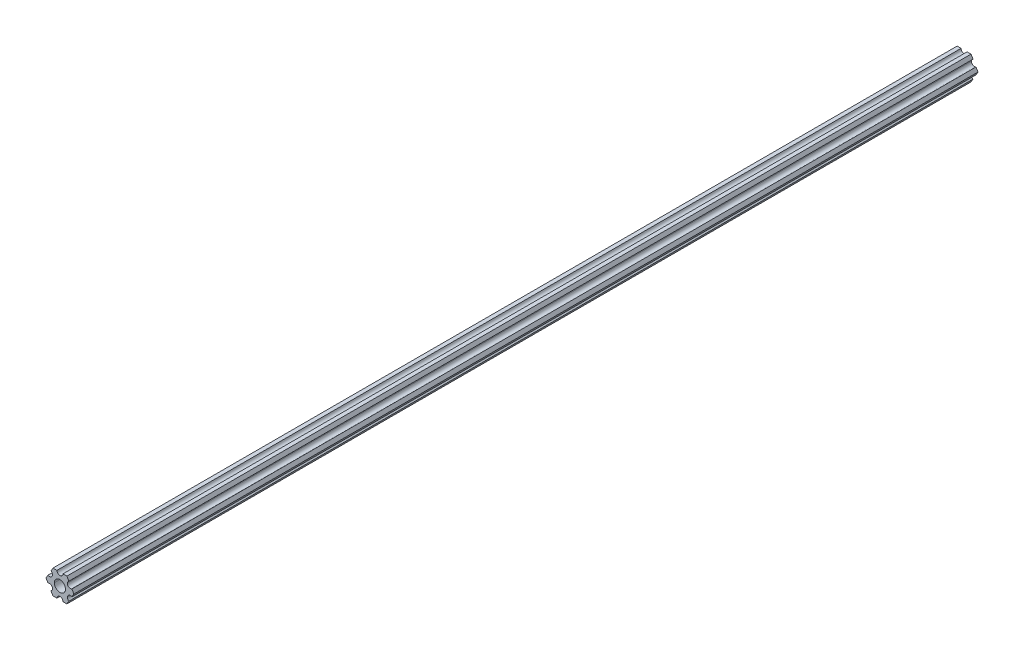
ISO-10303-21;
HEADER;
FILE_DESCRIPTION(('STEP AP214'),'2;1');
FILE_NAME('part.step','',(''),(''),'','','');
FILE_SCHEMA(('AUTOMOTIVE_DESIGN { 1 0 10303 214 1 1 1 1 }'));
ENDSEC;
DATA;
#1=APPLICATION_CONTEXT('core data for automotive mechanical design processes');
#2=APPLICATION_PROTOCOL_DEFINITION('international standard','automotive_design',2000,#1);
#3=PRODUCT_CONTEXT('',#1,'mechanical');
#4=PRODUCT('Part','Part','',(#3));
#5=PRODUCT_RELATED_PRODUCT_CATEGORY('part','',(#4));
#6=PRODUCT_DEFINITION_FORMATION('','',#4);
#7=PRODUCT_DEFINITION_CONTEXT('part definition',#1,'design');
#8=PRODUCT_DEFINITION('design','',#6,#7);
#9=PRODUCT_DEFINITION_SHAPE('','',#8);
#10=(LENGTH_UNIT() NAMED_UNIT(*) SI_UNIT(.MILLI.,.METRE.));
#11=(NAMED_UNIT(*) PLANE_ANGLE_UNIT() SI_UNIT($,.RADIAN.));
#12=(NAMED_UNIT(*) SI_UNIT($,.STERADIAN.) SOLID_ANGLE_UNIT());
#13=UNCERTAINTY_MEASURE_WITH_UNIT(LENGTH_MEASURE(1.E-05),#10,'distance_accuracy_value','');
#14=(GEOMETRIC_REPRESENTATION_CONTEXT(3) GLOBAL_UNCERTAINTY_ASSIGNED_CONTEXT((#13)) GLOBAL_UNIT_ASSIGNED_CONTEXT((#10,
#11,#12)) REPRESENTATION_CONTEXT('',''));
#15=CARTESIAN_POINT('',(0.,0.,0.));
#16=DIRECTION('',(0.,0.,1.));
#17=DIRECTION('',(1.,0.,0.));
#18=AXIS2_PLACEMENT_3D('',#15,#16,#17);
#19=CARTESIAN_POINT('',(0.,0.,304.8));
#20=DIRECTION('',(0.,0.,-1.));
#21=DIRECTION('',(-1.,0.,0.));
#22=AXIS2_PLACEMENT_3D('',#19,#20,#21);
#23=CYLINDRICAL_SURFACE('',#22,2.9337);
#24=CARTESIAN_POINT('',(0.,0.,476.25));
#25=DIRECTION('',(0.,0.,1.));
#26=DIRECTION('',(1.,0.,0.));
#27=AXIS2_PLACEMENT_3D('',#24,#25,#26);
#28=CIRCLE('',#27,2.9337);
#29=CARTESIAN_POINT('',(-2.9337,0.,476.25));
#30=VERTEX_POINT('',#29);
#31=CARTESIAN_POINT('',(2.9337,0.,476.25));
#32=VERTEX_POINT('',#31);
#33=EDGE_CURVE('E12',#30,#32,#28,.T.);
#34=ORIENTED_EDGE('',*,*,#33,.T.);
#35=DIRECTION('',(0.,0.,-1.));
#36=VECTOR('',#35,1.);
#37=CARTESIAN_POINT('',(2.9337,0.,304.8));
#38=LINE('',#37,#36);
#39=CARTESIAN_POINT('',(2.9337,0.,0.));
#40=VERTEX_POINT('',#39);
#41=EDGE_CURVE('E67',#32,#40,#38,.T.);
#42=ORIENTED_EDGE('',*,*,#41,.T.);
#43=CARTESIAN_POINT('',(0.,0.,0.));
#44=DIRECTION('',(0.,0.,1.));
#45=DIRECTION('',(1.,0.,0.));
#46=AXIS2_PLACEMENT_3D('',#43,#44,#45);
#47=CIRCLE('',#46,2.9337);
#48=CARTESIAN_POINT('',(-2.9337,0.,0.));
#49=VERTEX_POINT('',#48);
#50=EDGE_CURVE('E379',#49,#40,#47,.T.);
#51=ORIENTED_EDGE('',*,*,#50,.F.);
#52=DIRECTION('',(0.,0.,-1.));
#53=VECTOR('',#52,1.);
#54=CARTESIAN_POINT('',(-2.9337,0.,304.8));
#55=LINE('',#54,#53);
#56=EDGE_CURVE('E509',#30,#49,#55,.T.);
#57=ORIENTED_EDGE('',*,*,#56,.F.);
#58=EDGE_LOOP('',(#34,#42,#51,#57));
#59=FACE_BOUND('',#58,.T.);
#60=ADVANCED_FACE('F56',(#59),#23,.F.);
#61=CARTESIAN_POINT('',(5.49926150638082,-3.17499966684067,304.8));
#62=DIRECTION('',(0.,0.,-1.));
#63=DIRECTION('',(-1.,0.,0.));
#64=AXIS2_PLACEMENT_3D('',#61,#62,#63);
#65=CYLINDRICAL_SURFACE('',#64,1.5875);
#66=CARTESIAN_POINT('',(5.49926150638082,-3.17499966684067,476.25));
#67=DIRECTION('',(0.,0.,-1.));
#68=DIRECTION('',(1.,0.,0.));
#69=AXIS2_PLACEMENT_3D('',#66,#67,#68);
#70=CIRCLE('',#69,1.5875);
#71=CARTESIAN_POINT('',(3.91176150638082,-3.17499966684067,476.25));
#72=VERTEX_POINT('',#71);
#73=CARTESIAN_POINT('',(6.29301142309098,-1.80018429024546,476.25));
#74=VERTEX_POINT('',#73);
#75=EDGE_CURVE('E374',#72,#74,#70,.T.);
#76=ORIENTED_EDGE('',*,*,#75,.F.);
#77=DIRECTION('',(0.,0.,-1.));
#78=VECTOR('',#77,1.);
#79=CARTESIAN_POINT('',(3.91176150638082,-3.17499966684067,304.8));
#80=LINE('',#79,#78);
#81=CARTESIAN_POINT('',(3.91176150638082,-3.17499966684067,0.));
#82=VERTEX_POINT('',#81);
#83=EDGE_CURVE('E464',#72,#82,#80,.T.);
#84=ORIENTED_EDGE('',*,*,#83,.T.);
#85=CARTESIAN_POINT('',(5.49926150638082,-3.17499966684067,0.));
#86=DIRECTION('',(0.,0.,-1.));
#87=DIRECTION('',(1.,0.,0.));
#88=AXIS2_PLACEMENT_3D('',#85,#86,#87);
#89=CIRCLE('',#88,1.5875);
#90=CARTESIAN_POINT('',(6.29301142309098,-1.80018429024546,0.));
#91=VERTEX_POINT('',#90);
#92=EDGE_CURVE('E460',#82,#91,#89,.T.);
#93=ORIENTED_EDGE('',*,*,#92,.T.);
#94=DIRECTION('',(0.,0.,-1.));
#95=VECTOR('',#94,1.);
#96=CARTESIAN_POINT('',(6.29301142309098,-1.80018429024546,304.8));
#97=LINE('',#96,#95);
#98=EDGE_CURVE('E330',#74,#91,#97,.T.);
#99=ORIENTED_EDGE('',*,*,#98,.F.);
#100=EDGE_LOOP('',(#76,#84,#93,#99));
#101=FACE_BOUND('',#100,.T.);
#102=ADVANCED_FACE('F536',(#101),#65,.F.);
#103=CARTESIAN_POINT('',(5.49926112168156,3.17500033315934,304.8));
#104=DIRECTION('',(0.,0.,-1.));
#105=DIRECTION('',(-1.,0.,0.));
#106=AXIS2_PLACEMENT_3D('',#103,#104,#105);
#107=CYLINDRICAL_SURFACE('',#106,1.5875);
#108=CARTESIAN_POINT('',(5.49926112168156,3.17500033315934,476.25));
#109=DIRECTION('',(0.,0.,-1.));
#110=DIRECTION('',(1.,0.,0.));
#111=AXIS2_PLACEMENT_3D('',#108,#109,#110);
#112=CIRCLE('',#111,1.5875);
#113=CARTESIAN_POINT('',(3.91176112168156,3.17500033315934,476.25));
#114=VERTEX_POINT('',#113);
#115=CARTESIAN_POINT('',(4.70551103839172,4.54981561357972,476.25));
#116=VERTEX_POINT('',#115);
#117=EDGE_CURVE('E436',#114,#116,#112,.T.);
#118=ORIENTED_EDGE('',*,*,#117,.F.);
#119=DIRECTION('',(0.,0.,-1.));
#120=VECTOR('',#119,1.);
#121=CARTESIAN_POINT('',(3.91176112168156,3.17500033315934,304.8));
#122=LINE('',#121,#120);
#123=CARTESIAN_POINT('',(3.91176112168156,3.17500033315934,0.));
#124=VERTEX_POINT('',#123);
#125=EDGE_CURVE('E320',#114,#124,#122,.T.);
#126=ORIENTED_EDGE('',*,*,#125,.T.);
#127=CARTESIAN_POINT('',(5.49926112168156,3.17500033315934,0.));
#128=DIRECTION('',(0.,0.,-1.));
#129=DIRECTION('',(1.,0.,0.));
#130=AXIS2_PLACEMENT_3D('',#127,#128,#129);
#131=CIRCLE('',#130,1.5875);
#132=CARTESIAN_POINT('',(4.70551103839172,4.54981561357972,0.));
#133=VERTEX_POINT('',#132);
#134=EDGE_CURVE('E317',#124,#133,#131,.T.);
#135=ORIENTED_EDGE('',*,*,#134,.T.);
#136=DIRECTION('',(0.,0.,-1.));
#137=VECTOR('',#136,1.);
#138=CARTESIAN_POINT('',(4.70551103839172,4.54981561357972,304.8));
#139=LINE('',#138,#137);
#140=EDGE_CURVE('E310',#116,#133,#139,.T.);
#141=ORIENTED_EDGE('',*,*,#140,.F.);
#142=EDGE_LOOP('',(#118,#126,#135,#141));
#143=FACE_BOUND('',#142,.T.);
#144=ADVANCED_FACE('F532',(#143),#107,.F.);
#145=CARTESIAN_POINT('',(5.49926112168156,3.17500033315934,476.25));
#146=DIRECTION('',(0.,0.,1.));
#147=DIRECTION('',(1.,0.,0.));
#148=AXIS2_PLACEMENT_3D('',#145,#146,#147);
#149=PLANE('',#148);
#150=DIRECTION('',(0.499999947533953,0.866025434075723,0.));
#151=VECTOR('',#150,1.);
#152=CARTESIAN_POINT('',(6.29301142309098,-1.80018429024546,476.25));
#153=LINE('',#152,#151);
#154=CARTESIAN_POINT('',(7.33234841870827,4.44212519169686E-07,476.25));
#155=VERTEX_POINT('',#154);
#156=EDGE_CURVE('E321',#74,#155,#153,.T.);
#157=ORIENTED_EDGE('',*,*,#156,.T.);
#158=DIRECTION('',(-0.500000052466056,0.866025373493145,0.));
#159=VECTOR('',#158,1.);
#160=CARTESIAN_POINT('',(7.33234841870827,4.44212519169686E-07,476.25));
#161=LINE('',#160,#159);
#162=CARTESIAN_POINT('',(6.29301120497139,1.80018505273894,476.25));
#163=VERTEX_POINT('',#162);
#164=EDGE_CURVE('E373',#155,#163,#161,.T.);
#165=ORIENTED_EDGE('',*,*,#164,.T.);
#166=CARTESIAN_POINT('',(5.49926112168156,3.17500033315934,476.25));
#167=DIRECTION('',(0.,0.,-1.));
#168=DIRECTION('',(1.,0.,0.));
#169=AXIS2_PLACEMENT_3D('',#166,#167,#168);
#170=CIRCLE('',#169,1.5875);
#171=EDGE_CURVE('E440',#163,#114,#170,.T.);
#172=ORIENTED_EDGE('',*,*,#171,.T.);
#173=ORIENTED_EDGE('',*,*,#117,.T.);
#174=DIRECTION('',(-0.500000052466046,0.866025373493151,0.));
#175=VECTOR('',#174,1.);
#176=CARTESIAN_POINT('',(4.70551103839172,4.54981561357972,476.25));
#177=LINE('',#176,#175);
#178=CARTESIAN_POINT('',(3.66617382465481,6.35000022210627,476.25));
#179=VERTEX_POINT('',#178);
#180=EDGE_CURVE('E432',#116,#179,#177,.T.);
#181=ORIENTED_EDGE('',*,*,#180,.T.);
#182=DIRECTION('',(-1.,-6.05825850611185E-08,0.));
#183=VECTOR('',#182,1.);
#184=CARTESIAN_POINT('',(3.66617382465481,6.35000022210627,476.25));
#185=LINE('',#184,#183);
#186=CARTESIAN_POINT('',(1.58749961530074,6.35000009617482,476.25));
#187=VERTEX_POINT('',#186);
#188=EDGE_CURVE('E428',#179,#187,#185,.T.);
#189=ORIENTED_EDGE('',*,*,#188,.T.);
#190=CARTESIAN_POINT('',(-3.84699260060323E-07,6.35,476.25));
#191=DIRECTION('',(0.,0.,-1.));
#192=DIRECTION('',(1.,0.,0.));
#193=AXIS2_PLACEMENT_3D('',#190,#191,#192);
#194=CIRCLE('',#193,1.5875);
#195=CARTESIAN_POINT('',(-1.58750038469926,6.34999990382519,476.25));
#196=VERTEX_POINT('',#195);
#197=EDGE_CURVE('E424',#187,#196,#194,.T.);
#198=ORIENTED_EDGE('',*,*,#197,.T.);
#199=DIRECTION('',(-1.,-6.05825963273174E-08,0.));
#200=VECTOR('',#199,1.);
#201=CARTESIAN_POINT('',(-1.58750038469926,6.34999990382518,476.25));
#202=LINE('',#201,#200);
#203=CARTESIAN_POINT('',(-3.66617459405349,6.3499997778937,476.25));
#204=VERTEX_POINT('',#203);
#205=EDGE_CURVE('E420',#196,#204,#202,.T.);
#206=ORIENTED_EDGE('',*,*,#205,.T.);
#207=DIRECTION('',(-0.499999947533943,-0.866025434075729,0.));
#208=VECTOR('',#207,1.);
#209=CARTESIAN_POINT('',(-3.66617459405349,6.3499997778937,476.25));
#210=LINE('',#209,#208);
#211=CARTESIAN_POINT('',(-4.70551158967065,4.54981504343587,476.25));
#212=VERTEX_POINT('',#211);
#213=EDGE_CURVE('E416',#204,#212,#210,.T.);
#214=ORIENTED_EDGE('',*,*,#213,.T.);
#215=CARTESIAN_POINT('',(-5.49926150638082,3.17499966684067,476.25));
#216=DIRECTION('',(0.,0.,-1.));
#217=DIRECTION('',(1.,0.,0.));
#218=AXIS2_PLACEMENT_3D('',#215,#216,#217);
#219=CIRCLE('',#218,1.5875);
#220=CARTESIAN_POINT('',(-6.29301142309098,1.80018429024547,476.25));
#221=VERTEX_POINT('',#220);
#222=EDGE_CURVE('E412',#212,#221,#219,.T.);
#223=ORIENTED_EDGE('',*,*,#222,.T.);
#224=DIRECTION('',(-0.499999947533951,-0.866025434075724,0.));
#225=VECTOR('',#224,1.);
#226=CARTESIAN_POINT('',(-6.29301142309098,1.80018429024547,476.25));
#227=LINE('',#226,#225);
#228=CARTESIAN_POINT('',(-7.33234841870827,-4.44212523790841E-07,476.25));
#229=VERTEX_POINT('',#228);
#230=EDGE_CURVE('E408',#221,#229,#227,.T.);
#231=ORIENTED_EDGE('',*,*,#230,.T.);
#232=DIRECTION('',(0.500000052466045,-0.866025373493151,0.));
#233=VECTOR('',#232,1.);
#234=CARTESIAN_POINT('',(-7.33234841870827,-4.44212523790841E-07,476.25));
#235=LINE('',#234,#233);
#236=CARTESIAN_POINT('',(-6.29301120497141,-1.80018505273897,476.25));
#237=VERTEX_POINT('',#236);
#238=EDGE_CURVE('E405',#229,#237,#235,.T.);
#239=ORIENTED_EDGE('',*,*,#238,.T.);
#240=CARTESIAN_POINT('',(-5.49926112168156,-3.17500033315934,476.25));
#241=DIRECTION('',(0.,0.,-1.));
#242=DIRECTION('',(1.,0.,0.));
#243=AXIS2_PLACEMENT_3D('',#240,#241,#242);
#244=CIRCLE('',#243,1.5875);
#245=CARTESIAN_POINT('',(-4.70551103839172,-4.54981561357972,476.25));
#246=VERTEX_POINT('',#245);
#247=EDGE_CURVE('E276',#237,#246,#244,.T.);
#248=ORIENTED_EDGE('',*,*,#247,.T.);
#249=DIRECTION('',(0.500000052466045,-0.866025373493152,0.));
#250=VECTOR('',#249,1.);
#251=CARTESIAN_POINT('',(-4.70551103839172,-4.54981561357972,476.25));
#252=LINE('',#251,#250);
#253=CARTESIAN_POINT('',(-3.66617382465481,-6.35000022210628,476.25));
#254=VERTEX_POINT('',#253);
#255=EDGE_CURVE('E399',#246,#254,#252,.T.);
#256=ORIENTED_EDGE('',*,*,#255,.T.);
#257=DIRECTION('',(1.,6.05825854783851E-08,0.));
#258=VECTOR('',#257,1.);
#259=CARTESIAN_POINT('',(-3.66617382465481,-6.35000022210628,476.25));
#260=LINE('',#259,#258);
#261=CARTESIAN_POINT('',(-1.58749961530073,-6.35000009617482,476.25));
#262=VERTEX_POINT('',#261);
#263=EDGE_CURVE('E395',#254,#262,#260,.T.);
#264=ORIENTED_EDGE('',*,*,#263,.T.);
#265=CARTESIAN_POINT('',(3.8469926204343E-07,-6.35,476.25));
#266=DIRECTION('',(0.,0.,-1.));
#267=DIRECTION('',(1.,0.,0.));
#268=AXIS2_PLACEMENT_3D('',#265,#266,#267);
#269=CIRCLE('',#268,1.5875);
#270=CARTESIAN_POINT('',(1.58750038469926,-6.34999990382518,476.25));
#271=VERTEX_POINT('',#270);
#272=EDGE_CURVE('E391',#262,#271,#269,.T.);
#273=ORIENTED_EDGE('',*,*,#272,.T.);
#274=DIRECTION('',(1.,6.05825721258438E-08,0.));
#275=VECTOR('',#274,1.);
#276=CARTESIAN_POINT('',(1.58750038469926,-6.34999990382518,476.25));
#277=LINE('',#276,#275);
#278=CARTESIAN_POINT('',(3.66617459405346,-6.34999977789375,476.25));
#279=VERTEX_POINT('',#278);
#280=EDGE_CURVE('E387',#271,#279,#277,.T.);
#281=ORIENTED_EDGE('',*,*,#280,.T.);
#282=DIRECTION('',(0.499999947533941,0.86602543407573,0.));
#283=VECTOR('',#282,1.);
#284=CARTESIAN_POINT('',(3.66617459405346,-6.34999977789375,476.25));
#285=LINE('',#284,#283);
#286=CARTESIAN_POINT('',(4.70551158967065,-4.54981504343587,476.25));
#287=VERTEX_POINT('',#286);
#288=EDGE_CURVE('E383',#279,#287,#285,.T.);
#289=ORIENTED_EDGE('',*,*,#288,.T.);
#290=CARTESIAN_POINT('',(5.49926150638082,-3.17499966684067,476.25));
#291=DIRECTION('',(0.,0.,-1.));
#292=DIRECTION('',(1.,0.,0.));
#293=AXIS2_PLACEMENT_3D('',#290,#291,#292);
#294=CIRCLE('',#293,1.5875);
#295=EDGE_CURVE('E378',#287,#72,#294,.T.);
#296=ORIENTED_EDGE('',*,*,#295,.T.);
#297=ORIENTED_EDGE('',*,*,#75,.T.);
#298=EDGE_LOOP('',(#157,#165,#172,#173,#181,#189,#198,#206,#214,#223,#231,#239,#248,#256,#264,
#273,#281,#289,#296,#297));
#299=FACE_BOUND('',#298,.T.);
#300=ORIENTED_EDGE('',*,*,#33,.F.);
#301=CARTESIAN_POINT('',(0.,0.,476.25));
#302=DIRECTION('',(0.,0.,1.));
#303=DIRECTION('',(1.,0.,0.));
#304=AXIS2_PLACEMENT_3D('',#301,#302,#303);
#305=CIRCLE('',#304,2.9337);
#306=EDGE_CURVE('E60',#32,#30,#305,.T.);
#307=ORIENTED_EDGE('',*,*,#306,.F.);
#308=EDGE_LOOP('',(#300,#307));
#309=FACE_BOUND('',#308,.T.);
#310=ADVANCED_FACE('F58',(#299,#309),#149,.T.);
#311=CARTESIAN_POINT('',(5.49926112168156,3.17500033315934,0.));
#312=DIRECTION('',(0.,0.,1.));
#313=DIRECTION('',(1.,0.,0.));
#314=AXIS2_PLACEMENT_3D('',#311,#312,#313);
#315=PLANE('',#314);
#316=DIRECTION('',(0.499999947533953,0.866025434075723,0.));
#317=VECTOR('',#316,1.);
#318=CARTESIAN_POINT('',(6.29301142309098,-1.80018429024546,0.));
#319=LINE('',#318,#317);
#320=CARTESIAN_POINT('',(7.33234841870827,4.44212519169686E-07,0.));
#321=VERTEX_POINT('',#320);
#322=EDGE_CURVE('E469',#91,#321,#319,.T.);
#323=ORIENTED_EDGE('',*,*,#322,.F.);
#324=ORIENTED_EDGE('',*,*,#92,.F.);
#325=CARTESIAN_POINT('',(5.49926150638082,-3.17499966684067,0.));
#326=DIRECTION('',(0.,0.,-1.));
#327=DIRECTION('',(1.,0.,0.));
#328=AXIS2_PLACEMENT_3D('',#325,#326,#327);
#329=CIRCLE('',#328,1.5875);
#330=CARTESIAN_POINT('',(4.70551158967065,-4.54981504343587,0.));
#331=VERTEX_POINT('',#330);
#332=EDGE_CURVE('E340',#331,#82,#329,.T.);
#333=ORIENTED_EDGE('',*,*,#332,.F.);
#334=DIRECTION('',(0.499999947533941,0.86602543407573,0.));
#335=VECTOR('',#334,1.);
#336=CARTESIAN_POINT('',(3.66617459405346,-6.34999977789375,0.));
#337=LINE('',#336,#335);
#338=CARTESIAN_POINT('',(3.66617459405346,-6.34999977789375,0.));
#339=VERTEX_POINT('',#338);
#340=EDGE_CURVE('E472',#339,#331,#337,.T.);
#341=ORIENTED_EDGE('',*,*,#340,.F.);
#342=DIRECTION('',(1.,6.05825721258438E-08,0.));
#343=VECTOR('',#342,1.);
#344=CARTESIAN_POINT('',(1.58750038469926,-6.34999990382518,0.));
#345=LINE('',#344,#343);
#346=CARTESIAN_POINT('',(1.58750038469926,-6.34999990382518,0.));
#347=VERTEX_POINT('',#346);
#348=EDGE_CURVE('E311',#347,#339,#345,.T.);
#349=ORIENTED_EDGE('',*,*,#348,.F.);
#350=CARTESIAN_POINT('',(3.8469926204343E-07,-6.35,0.));
#351=DIRECTION('',(0.,0.,-1.));
#352=DIRECTION('',(1.,0.,0.));
#353=AXIS2_PLACEMENT_3D('',#350,#351,#352);
#354=CIRCLE('',#353,1.5875);
#355=CARTESIAN_POINT('',(-1.58749961530073,-6.35000009617482,0.));
#356=VERTEX_POINT('',#355);
#357=EDGE_CURVE('E339',#356,#347,#354,.T.);
#358=ORIENTED_EDGE('',*,*,#357,.F.);
#359=DIRECTION('',(1.,6.05825854783851E-08,0.));
#360=VECTOR('',#359,1.);
#361=CARTESIAN_POINT('',(-3.66617382465481,-6.35000022210628,0.));
#362=LINE('',#361,#360);
#363=CARTESIAN_POINT('',(-3.66617382465481,-6.35000022210628,0.));
#364=VERTEX_POINT('',#363);
#365=EDGE_CURVE('E338',#364,#356,#362,.T.);
#366=ORIENTED_EDGE('',*,*,#365,.F.);
#367=DIRECTION('',(0.500000052466045,-0.866025373493152,0.));
#368=VECTOR('',#367,1.);
#369=CARTESIAN_POINT('',(-4.70551103839172,-4.54981561357972,0.));
#370=LINE('',#369,#368);
#371=CARTESIAN_POINT('',(-4.70551103839172,-4.54981561357972,0.));
#372=VERTEX_POINT('',#371);
#373=EDGE_CURVE('E257',#372,#364,#370,.T.);
#374=ORIENTED_EDGE('',*,*,#373,.F.);
#375=CARTESIAN_POINT('',(-5.49926112168156,-3.17500033315934,0.));
#376=DIRECTION('',(0.,0.,-1.));
#377=DIRECTION('',(1.,0.,0.));
#378=AXIS2_PLACEMENT_3D('',#375,#376,#377);
#379=CIRCLE('',#378,1.5875);
#380=CARTESIAN_POINT('',(-6.29301120497141,-1.80018505273897,0.));
#381=VERTEX_POINT('',#380);
#382=EDGE_CURVE('E249',#381,#372,#379,.T.);
#383=ORIENTED_EDGE('',*,*,#382,.F.);
#384=DIRECTION('',(0.500000052466045,-0.866025373493151,0.));
#385=VECTOR('',#384,1.);
#386=CARTESIAN_POINT('',(-7.33234841870827,-4.44212523790841E-07,0.));
#387=LINE('',#386,#385);
#388=CARTESIAN_POINT('',(-7.33234841870827,-4.44212523790841E-07,0.));
#389=VERTEX_POINT('',#388);
#390=EDGE_CURVE('E254',#389,#381,#387,.T.);
#391=ORIENTED_EDGE('',*,*,#390,.F.);
#392=DIRECTION('',(-0.499999947533951,-0.866025434075724,0.));
#393=VECTOR('',#392,1.);
#394=CARTESIAN_POINT('',(-6.29301142309098,1.80018429024547,0.));
#395=LINE('',#394,#393);
#396=CARTESIAN_POINT('',(-6.29301142309098,1.80018429024547,0.));
#397=VERTEX_POINT('',#396);
#398=EDGE_CURVE('E349',#397,#389,#395,.T.);
#399=ORIENTED_EDGE('',*,*,#398,.F.);
#400=CARTESIAN_POINT('',(-5.49926150638082,3.17499966684067,0.));
#401=DIRECTION('',(0.,0.,-1.));
#402=DIRECTION('',(1.,0.,0.));
#403=AXIS2_PLACEMENT_3D('',#400,#401,#402);
#404=CIRCLE('',#403,1.5875);
#405=CARTESIAN_POINT('',(-4.70551158967065,4.54981504343587,0.));
#406=VERTEX_POINT('',#405);
#407=EDGE_CURVE('E348',#406,#397,#404,.T.);
#408=ORIENTED_EDGE('',*,*,#407,.F.);
#409=DIRECTION('',(-0.499999947533943,-0.866025434075729,0.));
#410=VECTOR('',#409,1.);
#411=CARTESIAN_POINT('',(-3.66617459405349,6.3499997778937,0.));
#412=LINE('',#411,#410);
#413=CARTESIAN_POINT('',(-3.66617459405349,6.3499997778937,0.));
#414=VERTEX_POINT('',#413);
#415=EDGE_CURVE('E288',#414,#406,#412,.T.);
#416=ORIENTED_EDGE('',*,*,#415,.F.);
#417=DIRECTION('',(-1.,-6.05825963273174E-08,0.));
#418=VECTOR('',#417,1.);
#419=CARTESIAN_POINT('',(-1.58750038469926,6.34999990382518,0.));
#420=LINE('',#419,#418);
#421=CARTESIAN_POINT('',(-1.58750038469926,6.34999990382519,0.));
#422=VERTEX_POINT('',#421);
#423=EDGE_CURVE('E360',#422,#414,#420,.T.);
#424=ORIENTED_EDGE('',*,*,#423,.F.);
#425=CARTESIAN_POINT('',(-3.84699260060323E-07,6.35,0.));
#426=DIRECTION('',(0.,0.,-1.));
#427=DIRECTION('',(1.,0.,0.));
#428=AXIS2_PLACEMENT_3D('',#425,#426,#427);
#429=CIRCLE('',#428,1.5875);
#430=CARTESIAN_POINT('',(1.58749961530074,6.35000009617482,0.));
#431=VERTEX_POINT('',#430);
#432=EDGE_CURVE('E300',#431,#422,#429,.T.);
#433=ORIENTED_EDGE('',*,*,#432,.F.);
#434=DIRECTION('',(-1.,-6.05825850611185E-08,0.));
#435=VECTOR('',#434,1.);
#436=CARTESIAN_POINT('',(3.66617382465481,6.35000022210627,0.));
#437=LINE('',#436,#435);
#438=CARTESIAN_POINT('',(3.66617382465481,6.35000022210627,0.));
#439=VERTEX_POINT('',#438);
#440=EDGE_CURVE('E324',#439,#431,#437,.T.);
#441=ORIENTED_EDGE('',*,*,#440,.F.);
#442=DIRECTION('',(-0.500000052466046,0.866025373493151,0.));
#443=VECTOR('',#442,1.);
#444=CARTESIAN_POINT('',(4.70551103839172,4.54981561357972,0.));
#445=LINE('',#444,#443);
#446=EDGE_CURVE('E306',#133,#439,#445,.T.);
#447=ORIENTED_EDGE('',*,*,#446,.F.);
#448=ORIENTED_EDGE('',*,*,#134,.F.);
#449=CARTESIAN_POINT('',(5.49926112168156,3.17500033315934,0.));
#450=DIRECTION('',(0.,0.,-1.));
#451=DIRECTION('',(1.,0.,0.));
#452=AXIS2_PLACEMENT_3D('',#449,#450,#451);
#453=CIRCLE('',#452,1.5875);
#454=CARTESIAN_POINT('',(6.29301120497139,1.80018505273894,0.));
#455=VERTEX_POINT('',#454);
#456=EDGE_CURVE('E299',#455,#124,#453,.T.);
#457=ORIENTED_EDGE('',*,*,#456,.F.);
#458=DIRECTION('',(-0.500000052466056,0.866025373493145,0.));
#459=VECTOR('',#458,1.);
#460=CARTESIAN_POINT('',(7.33234841870827,4.44212519169686E-07,0.));
#461=LINE('',#460,#459);
#462=EDGE_CURVE('E326',#321,#455,#461,.T.);
#463=ORIENTED_EDGE('',*,*,#462,.F.);
#464=EDGE_LOOP('',(#323,#324,#333,#341,#349,#358,#366,#374,#383,#391,#399,#408,#416,#424,#433,
#441,#447,#448,#457,#463));
#465=FACE_BOUND('',#464,.T.);
#466=ORIENTED_EDGE('',*,*,#50,.T.);
#467=CARTESIAN_POINT('',(0.,0.,0.));
#468=DIRECTION('',(0.,0.,1.));
#469=DIRECTION('',(1.,0.,0.));
#470=AXIS2_PLACEMENT_3D('',#467,#468,#469);
#471=CIRCLE('',#470,2.9337);
#472=EDGE_CURVE('E286',#40,#49,#471,.T.);
#473=ORIENTED_EDGE('',*,*,#472,.T.);
#474=EDGE_LOOP('',(#466,#473));
#475=FACE_BOUND('',#474,.T.);
#476=ADVANCED_FACE('F252',(#465,#475),#315,.F.);
#477=CARTESIAN_POINT('',(6.29301142309098,-1.80018429024546,304.8));
#478=DIRECTION('',(-0.866025434075723,0.499999947533953,0.));
#479=DIRECTION('',(0.,0.,1.));
#480=AXIS2_PLACEMENT_3D('',#477,#478,#479);
#481=PLANE('',#480);
#482=ORIENTED_EDGE('',*,*,#322,.T.);
#483=DIRECTION('',(0.,0.,-1.));
#484=VECTOR('',#483,1.);
#485=CARTESIAN_POINT('',(7.33234841870827,4.44212519169686E-07,304.8));
#486=LINE('',#485,#484);
#487=EDGE_CURVE('E298',#155,#321,#486,.T.);
#488=ORIENTED_EDGE('',*,*,#487,.F.);
#489=ORIENTED_EDGE('',*,*,#156,.F.);
#490=ORIENTED_EDGE('',*,*,#98,.T.);
#491=EDGE_LOOP('',(#482,#488,#489,#490));
#492=FACE_BOUND('',#491,.T.);
#493=ADVANCED_FACE('F534',(#492),#481,.F.);
#494=CARTESIAN_POINT('',(7.33234841870827,4.44212519169686E-07,304.8));
#495=DIRECTION('',(-0.866025373493145,-0.500000052466057,0.));
#496=DIRECTION('',(-0.500000052466057,0.866025373493145,0.));
#497=AXIS2_PLACEMENT_3D('',#494,#495,#496);
#498=PLANE('',#497);
#499=ORIENTED_EDGE('',*,*,#462,.T.);
#500=DIRECTION('',(0.,0.,-1.));
#501=VECTOR('',#500,1.);
#502=CARTESIAN_POINT('',(6.29301120497139,1.80018505273894,304.8));
#503=LINE('',#502,#501);
#504=EDGE_CURVE('E294',#163,#455,#503,.T.);
#505=ORIENTED_EDGE('',*,*,#504,.F.);
#506=ORIENTED_EDGE('',*,*,#164,.F.);
#507=ORIENTED_EDGE('',*,*,#487,.T.);
#508=EDGE_LOOP('',(#499,#505,#506,#507));
#509=FACE_BOUND('',#508,.T.);
#510=ADVANCED_FACE('F453',(#509),#498,.F.);
#511=CARTESIAN_POINT('',(5.49926112168156,3.17500033315934,304.8));
#512=DIRECTION('',(0.,0.,-1.));
#513=DIRECTION('',(-1.,0.,0.));
#514=AXIS2_PLACEMENT_3D('',#511,#512,#513);
#515=CYLINDRICAL_SURFACE('',#514,1.5875);
#516=ORIENTED_EDGE('',*,*,#125,.F.);
#517=ORIENTED_EDGE('',*,*,#171,.F.);
#518=ORIENTED_EDGE('',*,*,#504,.T.);
#519=ORIENTED_EDGE('',*,*,#456,.T.);
#520=EDGE_LOOP('',(#516,#517,#518,#519));
#521=FACE_BOUND('',#520,.T.);
#522=ADVANCED_FACE('F456',(#521),#515,.F.);
#523=CARTESIAN_POINT('',(4.70551103839172,4.54981561357972,304.8));
#524=DIRECTION('',(-0.866025373493151,-0.500000052466046,0.));
#525=DIRECTION('',(-0.500000052466046,0.866025373493151,0.));
#526=AXIS2_PLACEMENT_3D('',#523,#524,#525);
#527=PLANE('',#526);
#528=ORIENTED_EDGE('',*,*,#446,.T.);
#529=DIRECTION('',(0.,0.,-1.));
#530=VECTOR('',#529,1.);
#531=CARTESIAN_POINT('',(3.66617382465481,6.35000022210627,304.8));
#532=LINE('',#531,#530);
#533=EDGE_CURVE('E304',#179,#439,#532,.T.);
#534=ORIENTED_EDGE('',*,*,#533,.F.);
#535=ORIENTED_EDGE('',*,*,#180,.F.);
#536=ORIENTED_EDGE('',*,*,#140,.T.);
#537=EDGE_LOOP('',(#528,#534,#535,#536));
#538=FACE_BOUND('',#537,.T.);
#539=ADVANCED_FACE('F530',(#538),#527,.F.);
#540=CARTESIAN_POINT('',(3.66617382465481,6.35000022210627,304.8));
#541=DIRECTION('',(6.05825850611185E-08,-1.,0.));
#542=DIRECTION('',(0.,0.,-1.));
#543=AXIS2_PLACEMENT_3D('',#540,#541,#542);
#544=PLANE('',#543);
#545=ORIENTED_EDGE('',*,*,#440,.T.);
#546=DIRECTION('',(0.,0.,-1.));
#547=VECTOR('',#546,1.);
#548=CARTESIAN_POINT('',(1.58749961530074,6.35000009617482,304.8));
#549=LINE('',#548,#547);
#550=EDGE_CURVE('E305',#187,#431,#549,.T.);
#551=ORIENTED_EDGE('',*,*,#550,.F.);
#552=ORIENTED_EDGE('',*,*,#188,.F.);
#553=ORIENTED_EDGE('',*,*,#533,.T.);
#554=EDGE_LOOP('',(#545,#551,#552,#553));
#555=FACE_BOUND('',#554,.T.);
#556=ADVANCED_FACE('F526',(#555),#544,.F.);
#557=CARTESIAN_POINT('',(-3.84699260060323E-07,6.35,304.8));
#558=DIRECTION('',(0.,0.,-1.));
#559=DIRECTION('',(-1.,0.,0.));
#560=AXIS2_PLACEMENT_3D('',#557,#558,#559);
#561=CYLINDRICAL_SURFACE('',#560,1.5875);
#562=ORIENTED_EDGE('',*,*,#432,.T.);
#563=DIRECTION('',(0.,0.,-1.));
#564=VECTOR('',#563,1.);
#565=CARTESIAN_POINT('',(-1.58750038469926,6.34999990382519,304.8));
#566=LINE('',#565,#564);
#567=EDGE_CURVE('E292',#196,#422,#566,.T.);
#568=ORIENTED_EDGE('',*,*,#567,.F.);
#569=ORIENTED_EDGE('',*,*,#197,.F.);
#570=ORIENTED_EDGE('',*,*,#550,.T.);
#571=EDGE_LOOP('',(#562,#568,#569,#570));
#572=FACE_BOUND('',#571,.T.);
#573=ADVANCED_FACE('F523',(#572),#561,.F.);
#574=CARTESIAN_POINT('',(-1.58750038469926,6.34999990382518,304.8));
#575=DIRECTION('',(6.05825963273174E-08,-1.,0.));
#576=DIRECTION('',(0.,0.,-1.));
#577=AXIS2_PLACEMENT_3D('',#574,#575,#576);
#578=PLANE('',#577);
#579=ORIENTED_EDGE('',*,*,#423,.T.);
#580=DIRECTION('',(0.,0.,-1.));
#581=VECTOR('',#580,1.);
#582=CARTESIAN_POINT('',(-3.66617459405349,6.3499997778937,304.8));
#583=LINE('',#582,#581);
#584=EDGE_CURVE('E293',#204,#414,#583,.T.);
#585=ORIENTED_EDGE('',*,*,#584,.F.);
#586=ORIENTED_EDGE('',*,*,#205,.F.);
#587=ORIENTED_EDGE('',*,*,#567,.T.);
#588=EDGE_LOOP('',(#579,#585,#586,#587));
#589=FACE_BOUND('',#588,.T.);
#590=ADVANCED_FACE('F565',(#589),#578,.F.);
#591=CARTESIAN_POINT('',(-3.66617459405349,6.3499997778937,304.8));
#592=DIRECTION('',(0.866025434075729,-0.499999947533942,0.));
#593=DIRECTION('',(0.,0.,-1.));
#594=AXIS2_PLACEMENT_3D('',#591,#592,#593);
#595=PLANE('',#594);
#596=ORIENTED_EDGE('',*,*,#415,.T.);
#597=DIRECTION('',(0.,0.,-1.));
#598=VECTOR('',#597,1.);
#599=CARTESIAN_POINT('',(-4.70551158967065,4.54981504343587,304.8));
#600=LINE('',#599,#598);
#601=EDGE_CURVE('E352',#212,#406,#600,.T.);
#602=ORIENTED_EDGE('',*,*,#601,.F.);
#603=ORIENTED_EDGE('',*,*,#213,.F.);
#604=ORIENTED_EDGE('',*,*,#584,.T.);
#605=EDGE_LOOP('',(#596,#602,#603,#604));
#606=FACE_BOUND('',#605,.T.);
#607=ADVANCED_FACE('F562',(#606),#595,.F.);
#608=CARTESIAN_POINT('',(-5.49926150638082,3.17499966684067,304.8));
#609=DIRECTION('',(0.,0.,-1.));
#610=DIRECTION('',(-1.,0.,0.));
#611=AXIS2_PLACEMENT_3D('',#608,#609,#610);
#612=CYLINDRICAL_SURFACE('',#611,1.5875);
#613=ORIENTED_EDGE('',*,*,#407,.T.);
#614=DIRECTION('',(0.,0.,-1.));
#615=VECTOR('',#614,1.);
#616=CARTESIAN_POINT('',(-6.29301142309098,1.80018429024547,304.8));
#617=LINE('',#616,#615);
#618=EDGE_CURVE('E272',#221,#397,#617,.T.);
#619=ORIENTED_EDGE('',*,*,#618,.F.);
#620=ORIENTED_EDGE('',*,*,#222,.F.);
#621=ORIENTED_EDGE('',*,*,#601,.T.);
#622=EDGE_LOOP('',(#613,#619,#620,#621));
#623=FACE_BOUND('',#622,.T.);
#624=ADVANCED_FACE('F559',(#623),#612,.F.);
#625=CARTESIAN_POINT('',(-6.29301142309098,1.80018429024547,304.8));
#626=DIRECTION('',(0.866025434075724,-0.499999947533952,0.));
#627=DIRECTION('',(0.,0.,-1.));
#628=AXIS2_PLACEMENT_3D('',#625,#626,#627);
#629=PLANE('',#628);
#630=ORIENTED_EDGE('',*,*,#398,.T.);
#631=DIRECTION('',(0.,0.,-1.));
#632=VECTOR('',#631,1.);
#633=CARTESIAN_POINT('',(-7.33234841870827,-4.44212523790841E-07,304.8));
#634=LINE('',#633,#632);
#635=EDGE_CURVE('E263',#229,#389,#634,.T.);
#636=ORIENTED_EDGE('',*,*,#635,.F.);
#637=ORIENTED_EDGE('',*,*,#230,.F.);
#638=ORIENTED_EDGE('',*,*,#618,.T.);
#639=EDGE_LOOP('',(#630,#636,#637,#638));
#640=FACE_BOUND('',#639,.T.);
#641=ADVANCED_FACE('F557',(#640),#629,.F.);
#642=CARTESIAN_POINT('',(-7.33234841870827,-4.44212523790841E-07,304.8));
#643=DIRECTION('',(0.866025373493151,0.500000052466045,0.));
#644=DIRECTION('',(0.,0.,-1.));
#645=AXIS2_PLACEMENT_3D('',#642,#643,#644);
#646=PLANE('',#645);
#647=ORIENTED_EDGE('',*,*,#390,.T.);
#648=DIRECTION('',(0.,0.,-1.));
#649=VECTOR('',#648,1.);
#650=CARTESIAN_POINT('',(-6.29301120497141,-1.80018505273897,304.8));
#651=LINE('',#650,#649);
#652=EDGE_CURVE('E264',#237,#381,#651,.T.);
#653=ORIENTED_EDGE('',*,*,#652,.F.);
#654=ORIENTED_EDGE('',*,*,#238,.F.);
#655=ORIENTED_EDGE('',*,*,#635,.T.);
#656=EDGE_LOOP('',(#647,#653,#654,#655));
#657=FACE_BOUND('',#656,.T.);
#658=ADVANCED_FACE('F269',(#657),#646,.F.);
#659=CARTESIAN_POINT('',(-5.49926112168156,-3.17500033315934,304.8));
#660=DIRECTION('',(0.,0.,-1.));
#661=DIRECTION('',(-1.,0.,0.));
#662=AXIS2_PLACEMENT_3D('',#659,#660,#661);
#663=CYLINDRICAL_SURFACE('',#662,1.5875);
#664=ORIENTED_EDGE('',*,*,#382,.T.);
#665=DIRECTION('',(0.,0.,-1.));
#666=VECTOR('',#665,1.);
#667=CARTESIAN_POINT('',(-4.70551103839172,-4.54981561357972,304.8));
#668=LINE('',#667,#666);
#669=EDGE_CURVE('E282',#246,#372,#668,.T.);
#670=ORIENTED_EDGE('',*,*,#669,.F.);
#671=ORIENTED_EDGE('',*,*,#247,.F.);
#672=ORIENTED_EDGE('',*,*,#652,.T.);
#673=EDGE_LOOP('',(#664,#670,#671,#672));
#674=FACE_BOUND('',#673,.T.);
#675=ADVANCED_FACE('F274',(#674),#663,.F.);
#676=CARTESIAN_POINT('',(-4.70551103839172,-4.54981561357972,304.8));
#677=DIRECTION('',(0.866025373493152,0.500000052466045,0.));
#678=DIRECTION('',(0.,0.,-1.));
#679=AXIS2_PLACEMENT_3D('',#676,#677,#678);
#680=PLANE('',#679);
#681=ORIENTED_EDGE('',*,*,#373,.T.);
#682=DIRECTION('',(0.,0.,-1.));
#683=VECTOR('',#682,1.);
#684=CARTESIAN_POINT('',(-3.66617382465481,-6.35000022210628,304.8));
#685=LINE('',#684,#683);
#686=EDGE_CURVE('E334',#254,#364,#685,.T.);
#687=ORIENTED_EDGE('',*,*,#686,.F.);
#688=ORIENTED_EDGE('',*,*,#255,.F.);
#689=ORIENTED_EDGE('',*,*,#669,.T.);
#690=EDGE_LOOP('',(#681,#687,#688,#689));
#691=FACE_BOUND('',#690,.T.);
#692=ADVANCED_FACE('F554',(#691),#680,.F.);
#693=CARTESIAN_POINT('',(-3.66617382465481,-6.35000022210628,304.8));
#694=DIRECTION('',(-6.05825854783851E-08,1.,0.));
#695=DIRECTION('',(0.,0.,1.));
#696=AXIS2_PLACEMENT_3D('',#693,#694,#695);
#697=PLANE('',#696);
#698=ORIENTED_EDGE('',*,*,#365,.T.);
#699=DIRECTION('',(0.,0.,-1.));
#700=VECTOR('',#699,1.);
#701=CARTESIAN_POINT('',(-1.58749961530073,-6.35000009617482,304.8));
#702=LINE('',#701,#700);
#703=EDGE_CURVE('E315',#262,#356,#702,.T.);
#704=ORIENTED_EDGE('',*,*,#703,.F.);
#705=ORIENTED_EDGE('',*,*,#263,.F.);
#706=ORIENTED_EDGE('',*,*,#686,.T.);
#707=EDGE_LOOP('',(#698,#704,#705,#706));
#708=FACE_BOUND('',#707,.T.);
#709=ADVANCED_FACE('F551',(#708),#697,.F.);
#710=CARTESIAN_POINT('',(3.8469926204343E-07,-6.35,304.8));
#711=DIRECTION('',(0.,0.,-1.));
#712=DIRECTION('',(-1.,0.,0.));
#713=AXIS2_PLACEMENT_3D('',#710,#711,#712);
#714=CYLINDRICAL_SURFACE('',#713,1.5875);
#715=ORIENTED_EDGE('',*,*,#357,.T.);
#716=DIRECTION('',(0.,0.,-1.));
#717=VECTOR('',#716,1.);
#718=CARTESIAN_POINT('',(1.58750038469926,-6.34999990382518,304.8));
#719=LINE('',#718,#717);
#720=EDGE_CURVE('E316',#271,#347,#719,.T.);
#721=ORIENTED_EDGE('',*,*,#720,.F.);
#722=ORIENTED_EDGE('',*,*,#272,.F.);
#723=ORIENTED_EDGE('',*,*,#703,.T.);
#724=EDGE_LOOP('',(#715,#721,#722,#723));
#725=FACE_BOUND('',#724,.T.);
#726=ADVANCED_FACE('F548',(#725),#714,.F.);
#727=CARTESIAN_POINT('',(1.58750038469926,-6.34999990382518,304.8));
#728=DIRECTION('',(-6.05825721258438E-08,1.,0.));
#729=DIRECTION('',(0.,0.,1.));
#730=AXIS2_PLACEMENT_3D('',#727,#728,#729);
#731=PLANE('',#730);
#732=ORIENTED_EDGE('',*,*,#348,.T.);
#733=DIRECTION('',(0.,0.,-1.));
#734=VECTOR('',#733,1.);
#735=CARTESIAN_POINT('',(3.66617459405346,-6.34999977789375,304.8));
#736=LINE('',#735,#734);
#737=EDGE_CURVE('E359',#279,#339,#736,.T.);
#738=ORIENTED_EDGE('',*,*,#737,.F.);
#739=ORIENTED_EDGE('',*,*,#280,.F.);
#740=ORIENTED_EDGE('',*,*,#720,.T.);
#741=EDGE_LOOP('',(#732,#738,#739,#740));
#742=FACE_BOUND('',#741,.T.);
#743=ADVANCED_FACE('F546',(#742),#731,.F.);
#744=CARTESIAN_POINT('',(3.66617459405346,-6.34999977789375,304.8));
#745=DIRECTION('',(-0.86602543407573,0.499999947533941,0.));
#746=DIRECTION('',(0.,0.,1.));
#747=AXIS2_PLACEMENT_3D('',#744,#745,#746);
#748=PLANE('',#747);
#749=ORIENTED_EDGE('',*,*,#340,.T.);
#750=DIRECTION('',(0.,0.,-1.));
#751=VECTOR('',#750,1.);
#752=CARTESIAN_POINT('',(4.70551158967065,-4.54981504343587,304.8));
#753=LINE('',#752,#751);
#754=EDGE_CURVE('E344',#287,#331,#753,.T.);
#755=ORIENTED_EDGE('',*,*,#754,.F.);
#756=ORIENTED_EDGE('',*,*,#288,.F.);
#757=ORIENTED_EDGE('',*,*,#737,.T.);
#758=EDGE_LOOP('',(#749,#755,#756,#757));
#759=FACE_BOUND('',#758,.T.);
#760=ADVANCED_FACE('F541',(#759),#748,.F.);
#761=CARTESIAN_POINT('',(5.49926150638082,-3.17499966684067,304.8));
#762=DIRECTION('',(0.,0.,-1.));
#763=DIRECTION('',(-1.,0.,0.));
#764=AXIS2_PLACEMENT_3D('',#761,#762,#763);
#765=CYLINDRICAL_SURFACE('',#764,1.5875);
#766=ORIENTED_EDGE('',*,*,#83,.F.);
#767=ORIENTED_EDGE('',*,*,#295,.F.);
#768=ORIENTED_EDGE('',*,*,#754,.T.);
#769=ORIENTED_EDGE('',*,*,#332,.T.);
#770=EDGE_LOOP('',(#766,#767,#768,#769));
#771=FACE_BOUND('',#770,.T.);
#772=ADVANCED_FACE('F543',(#771),#765,.F.);
#773=CARTESIAN_POINT('',(0.,0.,304.8));
#774=DIRECTION('',(0.,0.,-1.));
#775=DIRECTION('',(-1.,0.,0.));
#776=AXIS2_PLACEMENT_3D('',#773,#774,#775);
#777=CYLINDRICAL_SURFACE('',#776,2.9337);
#778=ORIENTED_EDGE('',*,*,#41,.F.);
#779=ORIENTED_EDGE('',*,*,#306,.T.);
#780=ORIENTED_EDGE('',*,*,#56,.T.);
#781=ORIENTED_EDGE('',*,*,#472,.F.);
#782=EDGE_LOOP('',(#778,#779,#780,#781));
#783=FACE_BOUND('',#782,.T.);
#784=ADVANCED_FACE('F604',(#783),#777,.F.);
#785=CLOSED_SHELL('',(#60,#102,#144,#310,#476,#493,#510,#522,#539,#556,#573,#590,#607,#624,#641,
#658,#675,#692,#709,#726,#743,#760,#772,#784));
#786=MANIFOLD_SOLID_BREP('B2',#785);
#787=ADVANCED_BREP_SHAPE_REPRESENTATION('',(#18,#786),#14);
#788=SHAPE_DEFINITION_REPRESENTATION(#9,#787);
ENDSEC;
END-ISO-10303-21;
